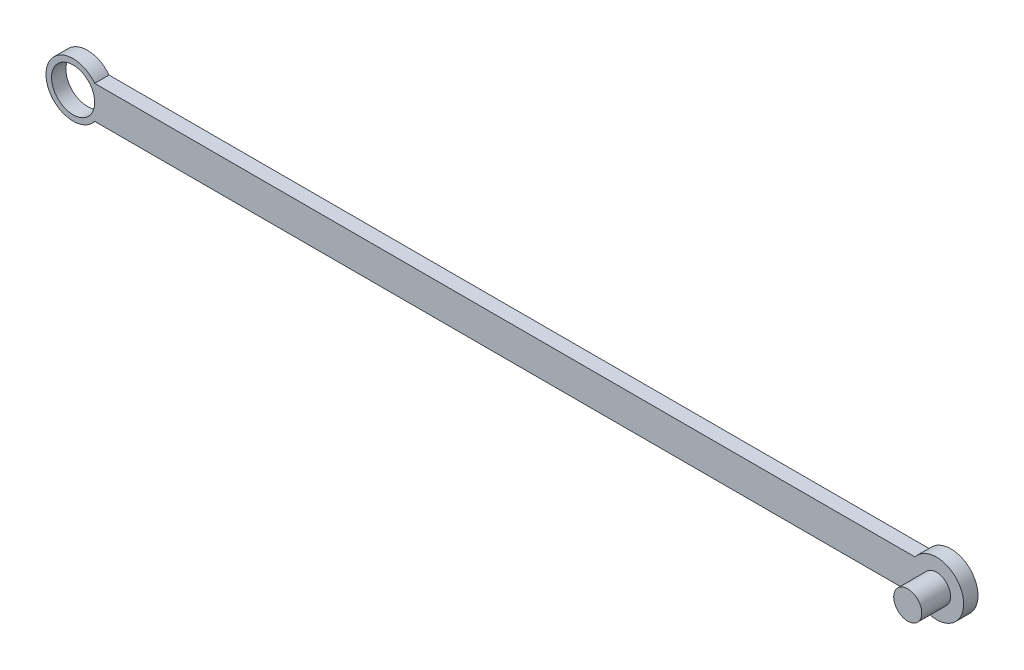
ISO-10303-21;
HEADER;
FILE_DESCRIPTION(('STEP AP214'),'2;1');
FILE_NAME('part.step','',(''),(''),'','','');
FILE_SCHEMA(('AUTOMOTIVE_DESIGN { 1 0 10303 214 1 1 1 1 }'));
ENDSEC;
DATA;
#1=APPLICATION_CONTEXT('core data for automotive mechanical design processes');
#2=APPLICATION_PROTOCOL_DEFINITION('international standard','automotive_design',2000,#1);
#3=PRODUCT_CONTEXT('',#1,'mechanical');
#4=PRODUCT('Part','Part','',(#3));
#5=PRODUCT_RELATED_PRODUCT_CATEGORY('part','',(#4));
#6=PRODUCT_DEFINITION_FORMATION('','',#4);
#7=PRODUCT_DEFINITION_CONTEXT('part definition',#1,'design');
#8=PRODUCT_DEFINITION('design','',#6,#7);
#9=PRODUCT_DEFINITION_SHAPE('','',#8);
#10=(LENGTH_UNIT() NAMED_UNIT(*) SI_UNIT(.MILLI.,.METRE.));
#11=(NAMED_UNIT(*) PLANE_ANGLE_UNIT() SI_UNIT($,.RADIAN.));
#12=(NAMED_UNIT(*) SI_UNIT($,.STERADIAN.) SOLID_ANGLE_UNIT());
#13=UNCERTAINTY_MEASURE_WITH_UNIT(LENGTH_MEASURE(1.E-05),#10,'distance_accuracy_value','');
#14=(GEOMETRIC_REPRESENTATION_CONTEXT(3) GLOBAL_UNCERTAINTY_ASSIGNED_CONTEXT((#13)) GLOBAL_UNIT_ASSIGNED_CONTEXT((#10,
#11,#12)) REPRESENTATION_CONTEXT('',''));
#15=CARTESIAN_POINT('',(0.,0.,0.));
#16=DIRECTION('',(0.,0.,1.));
#17=DIRECTION('',(1.,0.,0.));
#18=AXIS2_PLACEMENT_3D('',#15,#16,#17);
#19=CARTESIAN_POINT('',(0.,0.,1.));
#20=DIRECTION('',(0.,0.,-1.));
#21=DIRECTION('',(-1.,0.,0.));
#22=AXIS2_PLACEMENT_3D('',#19,#20,#21);
#23=PLANE('',#22);
#24=CARTESIAN_POINT('',(60.,0.,1.));
#25=DIRECTION('',(0.,0.,-1.));
#26=DIRECTION('',(-1.,0.,0.));
#27=AXIS2_PLACEMENT_3D('',#24,#25,#26);
#28=CIRCLE('',#27,0.974999999999999);
#29=CARTESIAN_POINT('',(59.025,0.,1.));
#30=VERTEX_POINT('',#29);
#31=EDGE_CURVE('E11',#30,#30,#28,.F.);
#32=ORIENTED_EDGE('',*,*,#31,.F.);
#33=EDGE_LOOP('',(#32));
#34=FACE_BOUND('',#33,.T.);
#35=CARTESIAN_POINT('',(0.,0.,1.));
#36=DIRECTION('',(0.,0.,1.));
#37=DIRECTION('',(-1.,0.,0.));
#38=AXIS2_PLACEMENT_3D('',#35,#36,#37);
#39=CIRCLE('',#38,1.88393728543768);
#40=CARTESIAN_POINT('',(1.49720065111148,1.14350772003238,1.));
#41=VERTEX_POINT('',#40);
#42=CARTESIAN_POINT('',(1.49720065111148,-1.14350772003238,1.));
#43=VERTEX_POINT('',#42);
#44=EDGE_CURVE('E85',#41,#43,#39,.T.);
#45=ORIENTED_EDGE('',*,*,#44,.T.);
#46=DIRECTION('',(1.,0.,0.));
#47=VECTOR('',#46,1.);
#48=CARTESIAN_POINT('',(1.49720065111148,-1.14350772003238,1.));
#49=LINE('',#48,#47);
#50=CARTESIAN_POINT('',(58.5027993488885,-1.14350772003238,1.));
#51=VERTEX_POINT('',#50);
#52=EDGE_CURVE('E88',#43,#51,#49,.T.);
#53=ORIENTED_EDGE('',*,*,#52,.T.);
#54=CARTESIAN_POINT('',(60.,0.,1.));
#55=DIRECTION('',(0.,0.,1.));
#56=DIRECTION('',(1.,0.,0.));
#57=AXIS2_PLACEMENT_3D('',#54,#55,#56);
#58=CIRCLE('',#57,1.88393728543768);
#59=CARTESIAN_POINT('',(58.5027993488885,1.14350772003238,1.));
#60=VERTEX_POINT('',#59);
#61=EDGE_CURVE('E92',#51,#60,#58,.T.);
#62=ORIENTED_EDGE('',*,*,#61,.T.);
#63=DIRECTION('',(-1.,0.,0.));
#64=VECTOR('',#63,1.);
#65=CARTESIAN_POINT('',(1.49720065111148,1.14350772003238,1.));
#66=LINE('',#65,#64);
#67=EDGE_CURVE('E57',#60,#41,#66,.T.);
#68=ORIENTED_EDGE('',*,*,#67,.T.);
#69=EDGE_LOOP('',(#45,#53,#62,#68));
#70=FACE_BOUND('',#69,.T.);
#71=CARTESIAN_POINT('',(0.,0.,1.));
#72=DIRECTION('',(0.,0.,1.));
#73=DIRECTION('',(1.,0.,0.));
#74=AXIS2_PLACEMENT_3D('',#71,#72,#73);
#75=CIRCLE('',#74,1.5);
#76=CARTESIAN_POINT('',(1.5,0.,1.));
#77=VERTEX_POINT('',#76);
#78=EDGE_CURVE('E114',#77,#77,#75,.T.);
#79=ORIENTED_EDGE('',*,*,#78,.F.);
#80=EDGE_LOOP('',(#79));
#81=FACE_BOUND('',#80,.T.);
#82=ADVANCED_FACE('F39',(#34,#70,#81),#23,.F.);
#83=CARTESIAN_POINT('',(0.,0.,0.));
#84=DIRECTION('',(0.,0.,-1.));
#85=DIRECTION('',(-1.,0.,0.));
#86=AXIS2_PLACEMENT_3D('',#83,#84,#85);
#87=PLANE('',#86);
#88=CARTESIAN_POINT('',(0.,0.,0.));
#89=DIRECTION('',(0.,0.,1.));
#90=DIRECTION('',(-1.,0.,0.));
#91=AXIS2_PLACEMENT_3D('',#88,#89,#90);
#92=CIRCLE('',#91,1.88393728543768);
#93=CARTESIAN_POINT('',(1.49720065111148,1.14350772003238,0.));
#94=VERTEX_POINT('',#93);
#95=CARTESIAN_POINT('',(1.49720065111148,-1.14350772003238,0.));
#96=VERTEX_POINT('',#95);
#97=EDGE_CURVE('E80',#94,#96,#92,.T.);
#98=ORIENTED_EDGE('',*,*,#97,.F.);
#99=DIRECTION('',(-1.,0.,0.));
#100=VECTOR('',#99,1.);
#101=CARTESIAN_POINT('',(1.49720065111148,1.14350772003238,0.));
#102=LINE('',#101,#100);
#103=CARTESIAN_POINT('',(58.5027993488885,1.14350772003238,0.));
#104=VERTEX_POINT('',#103);
#105=EDGE_CURVE('E119',#104,#94,#102,.T.);
#106=ORIENTED_EDGE('',*,*,#105,.F.);
#107=CARTESIAN_POINT('',(60.,0.,0.));
#108=DIRECTION('',(0.,0.,1.));
#109=DIRECTION('',(1.,0.,0.));
#110=AXIS2_PLACEMENT_3D('',#107,#108,#109);
#111=CIRCLE('',#110,1.88393728543768);
#112=CARTESIAN_POINT('',(58.5027993488885,-1.14350772003238,0.));
#113=VERTEX_POINT('',#112);
#114=EDGE_CURVE('E73',#113,#104,#111,.T.);
#115=ORIENTED_EDGE('',*,*,#114,.F.);
#116=DIRECTION('',(1.,0.,0.));
#117=VECTOR('',#116,1.);
#118=CARTESIAN_POINT('',(1.49720065111148,-1.14350772003238,0.));
#119=LINE('',#118,#117);
#120=EDGE_CURVE('E100',#96,#113,#119,.T.);
#121=ORIENTED_EDGE('',*,*,#120,.F.);
#122=EDGE_LOOP('',(#98,#106,#115,#121));
#123=FACE_BOUND('',#122,.T.);
#124=CARTESIAN_POINT('',(0.,0.,0.));
#125=DIRECTION('',(0.,0.,1.));
#126=DIRECTION('',(1.,0.,0.));
#127=AXIS2_PLACEMENT_3D('',#124,#125,#126);
#128=CIRCLE('',#127,1.5);
#129=CARTESIAN_POINT('',(1.5,0.,0.));
#130=VERTEX_POINT('',#129);
#131=EDGE_CURVE('E134',#130,#130,#128,.T.);
#132=ORIENTED_EDGE('',*,*,#131,.T.);
#133=EDGE_LOOP('',(#132));
#134=FACE_BOUND('',#133,.T.);
#135=ADVANCED_FACE('F128',(#123,#134),#87,.T.);
#136=CARTESIAN_POINT('',(0.,0.,1.));
#137=DIRECTION('',(0.,0.,-1.));
#138=DIRECTION('',(-1.,0.,0.));
#139=AXIS2_PLACEMENT_3D('',#136,#137,#138);
#140=CYLINDRICAL_SURFACE('',#139,1.88393728543768);
#141=ORIENTED_EDGE('',*,*,#97,.T.);
#142=DIRECTION('',(0.,0.,-1.));
#143=VECTOR('',#142,1.);
#144=CARTESIAN_POINT('',(1.49720065111148,-1.14350772003238,1.));
#145=LINE('',#144,#143);
#146=EDGE_CURVE('E49',#43,#96,#145,.T.);
#147=ORIENTED_EDGE('',*,*,#146,.F.);
#148=ORIENTED_EDGE('',*,*,#44,.F.);
#149=DIRECTION('',(0.,0.,-1.));
#150=VECTOR('',#149,1.);
#151=CARTESIAN_POINT('',(1.49720065111148,1.14350772003238,1.));
#152=LINE('',#151,#150);
#153=EDGE_CURVE('E108',#41,#94,#152,.T.);
#154=ORIENTED_EDGE('',*,*,#153,.T.);
#155=EDGE_LOOP('',(#141,#147,#148,#154));
#156=FACE_BOUND('',#155,.T.);
#157=ADVANCED_FACE('F41',(#156),#140,.T.);
#158=CARTESIAN_POINT('',(1.49720065111148,-1.14350772003238,1.));
#159=DIRECTION('',(0.,1.,0.));
#160=DIRECTION('',(-1.,0.,0.));
#161=AXIS2_PLACEMENT_3D('',#158,#159,#160);
#162=PLANE('',#161);
#163=ORIENTED_EDGE('',*,*,#120,.T.);
#164=DIRECTION('',(0.,0.,-1.));
#165=VECTOR('',#164,1.);
#166=CARTESIAN_POINT('',(58.5027993488885,-1.14350772003238,1.));
#167=LINE('',#166,#165);
#168=EDGE_CURVE('E98',#51,#113,#167,.T.);
#169=ORIENTED_EDGE('',*,*,#168,.F.);
#170=ORIENTED_EDGE('',*,*,#52,.F.);
#171=ORIENTED_EDGE('',*,*,#146,.T.);
#172=EDGE_LOOP('',(#163,#169,#170,#171));
#173=FACE_BOUND('',#172,.T.);
#174=ADVANCED_FACE('F99',(#173),#162,.F.);
#175=CARTESIAN_POINT('',(60.,0.,1.));
#176=DIRECTION('',(0.,0.,-1.));
#177=DIRECTION('',(-1.,0.,0.));
#178=AXIS2_PLACEMENT_3D('',#175,#176,#177);
#179=CYLINDRICAL_SURFACE('',#178,1.88393728543768);
#180=ORIENTED_EDGE('',*,*,#114,.T.);
#181=DIRECTION('',(0.,0.,-1.));
#182=VECTOR('',#181,1.);
#183=CARTESIAN_POINT('',(58.5027993488885,1.14350772003238,1.));
#184=LINE('',#183,#182);
#185=EDGE_CURVE('E102',#60,#104,#184,.T.);
#186=ORIENTED_EDGE('',*,*,#185,.F.);
#187=ORIENTED_EDGE('',*,*,#61,.F.);
#188=ORIENTED_EDGE('',*,*,#168,.T.);
#189=EDGE_LOOP('',(#180,#186,#187,#188));
#190=FACE_BOUND('',#189,.T.);
#191=ADVANCED_FACE('F104',(#190),#179,.T.);
#192=CARTESIAN_POINT('',(1.49720065111148,1.14350772003238,1.));
#193=DIRECTION('',(0.,-1.,0.));
#194=DIRECTION('',(1.,0.,0.));
#195=AXIS2_PLACEMENT_3D('',#192,#193,#194);
#196=PLANE('',#195);
#197=ORIENTED_EDGE('',*,*,#105,.T.);
#198=ORIENTED_EDGE('',*,*,#153,.F.);
#199=ORIENTED_EDGE('',*,*,#67,.F.);
#200=ORIENTED_EDGE('',*,*,#185,.T.);
#201=EDGE_LOOP('',(#197,#198,#199,#200));
#202=FACE_BOUND('',#201,.T.);
#203=ADVANCED_FACE('F131',(#202),#196,.F.);
#204=CARTESIAN_POINT('',(0.,0.,1.));
#205=DIRECTION('',(0.,0.,-1.));
#206=DIRECTION('',(-1.,0.,0.));
#207=AXIS2_PLACEMENT_3D('',#204,#205,#206);
#208=CYLINDRICAL_SURFACE('',#207,1.5);
#209=ORIENTED_EDGE('',*,*,#78,.T.);
#210=EDGE_LOOP('',(#209));
#211=FACE_BOUND('',#210,.T.);
#212=ORIENTED_EDGE('',*,*,#131,.F.);
#213=EDGE_LOOP('',(#212));
#214=FACE_BOUND('',#213,.T.);
#215=ADVANCED_FACE('F151',(#211,#214),#208,.F.);
#216=CARTESIAN_POINT('',(60.,0.,3.));
#217=DIRECTION('',(0.,0.,-1.));
#218=DIRECTION('',(-1.,0.,0.));
#219=AXIS2_PLACEMENT_3D('',#216,#217,#218);
#220=CYLINDRICAL_SURFACE('',#219,0.974999999999999);
#221=CARTESIAN_POINT('',(60.,0.,3.));
#222=DIRECTION('',(0.,0.,1.));
#223=DIRECTION('',(1.,0.,0.));
#224=AXIS2_PLACEMENT_3D('',#221,#222,#223);
#225=CIRCLE('',#224,0.974999999999999);
#226=CARTESIAN_POINT('',(60.975,0.,3.));
#227=VERTEX_POINT('',#226);
#228=EDGE_CURVE('E138',#227,#227,#225,.T.);
#229=ORIENTED_EDGE('',*,*,#228,.F.);
#230=EDGE_LOOP('',(#229));
#231=FACE_BOUND('',#230,.T.);
#232=ORIENTED_EDGE('',*,*,#31,.T.);
#233=EDGE_LOOP('',(#232));
#234=FACE_BOUND('',#233,.T.);
#235=ADVANCED_FACE('F148',(#231,#234),#220,.T.);
#236=CARTESIAN_POINT('',(60.,0.,3.));
#237=DIRECTION('',(0.,0.,1.));
#238=DIRECTION('',(1.,0.,0.));
#239=AXIS2_PLACEMENT_3D('',#236,#237,#238);
#240=PLANE('',#239);
#241=ORIENTED_EDGE('',*,*,#228,.T.);
#242=EDGE_LOOP('',(#241));
#243=FACE_BOUND('',#242,.T.);
#244=ADVANCED_FACE('F146',(#243),#240,.T.);
#245=CLOSED_SHELL('',(#82,#135,#157,#174,#191,#203,#215,#235,#244));
#246=MANIFOLD_SOLID_BREP('B2',#245);
#247=ADVANCED_BREP_SHAPE_REPRESENTATION('',(#18,#246),#14);
#248=SHAPE_DEFINITION_REPRESENTATION(#9,#247);
ENDSEC;
END-ISO-10303-21;
